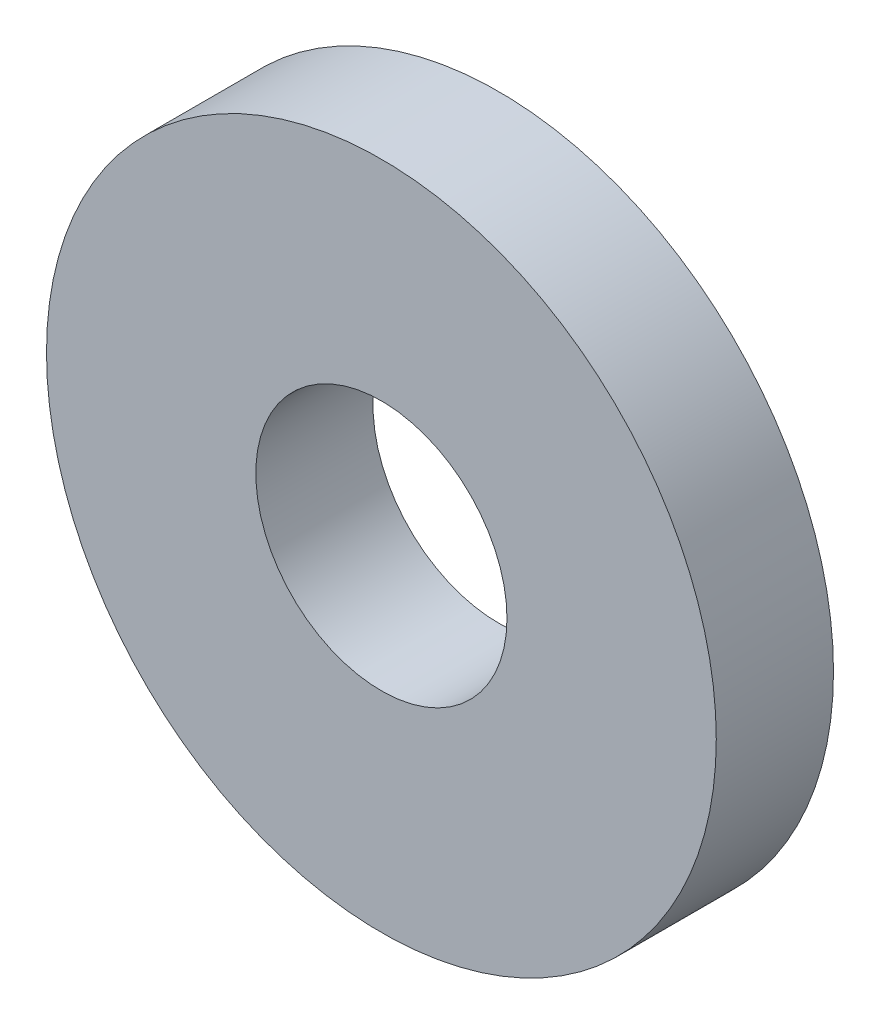
ISO-10303-21;
HEADER;
FILE_DESCRIPTION(('STEP AP214'),'2;1');
FILE_NAME('part.step','',(''),(''),'','','');
FILE_SCHEMA(('AUTOMOTIVE_DESIGN { 1 0 10303 214 1 1 1 1 }'));
ENDSEC;
DATA;
#1=APPLICATION_CONTEXT('core data for automotive mechanical design processes');
#2=APPLICATION_PROTOCOL_DEFINITION('international standard','automotive_design',2000,#1);
#3=PRODUCT_CONTEXT('',#1,'mechanical');
#4=PRODUCT('Part','Part','',(#3));
#5=PRODUCT_RELATED_PRODUCT_CATEGORY('part','',(#4));
#6=PRODUCT_DEFINITION_FORMATION('','',#4);
#7=PRODUCT_DEFINITION_CONTEXT('part definition',#1,'design');
#8=PRODUCT_DEFINITION('design','',#6,#7);
#9=PRODUCT_DEFINITION_SHAPE('','',#8);
#10=(LENGTH_UNIT() NAMED_UNIT(*) SI_UNIT(.MILLI.,.METRE.));
#11=(NAMED_UNIT(*) PLANE_ANGLE_UNIT() SI_UNIT($,.RADIAN.));
#12=(NAMED_UNIT(*) SI_UNIT($,.STERADIAN.) SOLID_ANGLE_UNIT());
#13=UNCERTAINTY_MEASURE_WITH_UNIT(LENGTH_MEASURE(1.E-05),#10,'distance_accuracy_value','');
#14=(GEOMETRIC_REPRESENTATION_CONTEXT(3) GLOBAL_UNCERTAINTY_ASSIGNED_CONTEXT((#13)) GLOBAL_UNIT_ASSIGNED_CONTEXT((#10,
#11,#12)) REPRESENTATION_CONTEXT('',''));
#15=CARTESIAN_POINT('',(0.,0.,0.));
#16=DIRECTION('',(0.,0.,1.));
#17=DIRECTION('',(1.,0.,0.));
#18=AXIS2_PLACEMENT_3D('',#15,#16,#17);
#19=CARTESIAN_POINT('',(0.,0.,7.));
#20=DIRECTION('',(0.,0.,1.));
#21=DIRECTION('',(1.,0.,0.));
#22=AXIS2_PLACEMENT_3D('',#19,#20,#21);
#23=PLANE('',#22);
#24=CARTESIAN_POINT('',(0.,0.,7.));
#25=DIRECTION('',(0.,0.,1.));
#26=DIRECTION('',(1.,0.,0.));
#27=AXIS2_PLACEMENT_3D('',#24,#25,#26);
#28=CIRCLE('',#27,20.);
#29=CARTESIAN_POINT('',(20.,0.,7.));
#30=VERTEX_POINT('',#29);
#31=EDGE_CURVE('E10',#30,#30,#28,.T.);
#32=ORIENTED_EDGE('',*,*,#31,.T.);
#33=EDGE_LOOP('',(#32));
#34=FACE_BOUND('',#33,.T.);
#35=CARTESIAN_POINT('',(0.,0.,7.));
#36=DIRECTION('',(0.,0.,1.));
#37=DIRECTION('',(1.,0.,0.));
#38=AXIS2_PLACEMENT_3D('',#35,#36,#37);
#39=CIRCLE('',#38,7.5);
#40=CARTESIAN_POINT('',(7.5,0.,7.));
#41=VERTEX_POINT('',#40);
#42=EDGE_CURVE('E48',#41,#41,#39,.T.);
#43=ORIENTED_EDGE('',*,*,#42,.F.);
#44=EDGE_LOOP('',(#43));
#45=FACE_BOUND('',#44,.T.);
#46=ADVANCED_FACE('F37',(#34,#45),#23,.T.);
#47=CARTESIAN_POINT('',(0.,0.,0.));
#48=DIRECTION('',(0.,0.,1.));
#49=DIRECTION('',(1.,0.,0.));
#50=AXIS2_PLACEMENT_3D('',#47,#48,#49);
#51=PLANE('',#50);
#52=CARTESIAN_POINT('',(0.,0.,0.));
#53=DIRECTION('',(0.,0.,1.));
#54=DIRECTION('',(1.,0.,0.));
#55=AXIS2_PLACEMENT_3D('',#52,#53,#54);
#56=CIRCLE('',#55,20.);
#57=CARTESIAN_POINT('',(20.,0.,0.));
#58=VERTEX_POINT('',#57);
#59=EDGE_CURVE('E41',#58,#58,#56,.T.);
#60=ORIENTED_EDGE('',*,*,#59,.F.);
#61=EDGE_LOOP('',(#60));
#62=FACE_BOUND('',#61,.T.);
#63=CARTESIAN_POINT('',(0.,0.,0.));
#64=DIRECTION('',(0.,0.,1.));
#65=DIRECTION('',(1.,0.,0.));
#66=AXIS2_PLACEMENT_3D('',#63,#64,#65);
#67=CIRCLE('',#66,7.5);
#68=CARTESIAN_POINT('',(7.5,0.,0.));
#69=VERTEX_POINT('',#68);
#70=EDGE_CURVE('E50',#69,#69,#67,.T.);
#71=ORIENTED_EDGE('',*,*,#70,.T.);
#72=EDGE_LOOP('',(#71));
#73=FACE_BOUND('',#72,.T.);
#74=ADVANCED_FACE('F60',(#62,#73),#51,.F.);
#75=CARTESIAN_POINT('',(0.,0.,7.));
#76=DIRECTION('',(0.,0.,-1.));
#77=DIRECTION('',(-1.,0.,0.));
#78=AXIS2_PLACEMENT_3D('',#75,#76,#77);
#79=CYLINDRICAL_SURFACE('',#78,20.);
#80=ORIENTED_EDGE('',*,*,#31,.F.);
#81=EDGE_LOOP('',(#80));
#82=FACE_BOUND('',#81,.T.);
#83=ORIENTED_EDGE('',*,*,#59,.T.);
#84=EDGE_LOOP('',(#83));
#85=FACE_BOUND('',#84,.T.);
#86=ADVANCED_FACE('F39',(#82,#85),#79,.T.);
#87=CARTESIAN_POINT('',(0.,0.,7.));
#88=DIRECTION('',(0.,0.,-1.));
#89=DIRECTION('',(-1.,0.,0.));
#90=AXIS2_PLACEMENT_3D('',#87,#88,#89);
#91=CYLINDRICAL_SURFACE('',#90,7.5);
#92=ORIENTED_EDGE('',*,*,#42,.T.);
#93=EDGE_LOOP('',(#92));
#94=FACE_BOUND('',#93,.T.);
#95=ORIENTED_EDGE('',*,*,#70,.F.);
#96=EDGE_LOOP('',(#95));
#97=FACE_BOUND('',#96,.T.);
#98=ADVANCED_FACE('F56',(#94,#97),#91,.F.);
#99=CLOSED_SHELL('',(#46,#74,#86,#98));
#100=MANIFOLD_SOLID_BREP('B2',#99);
#101=ADVANCED_BREP_SHAPE_REPRESENTATION('',(#18,#100),#14);
#102=SHAPE_DEFINITION_REPRESENTATION(#9,#101);
ENDSEC;
END-ISO-10303-21;
